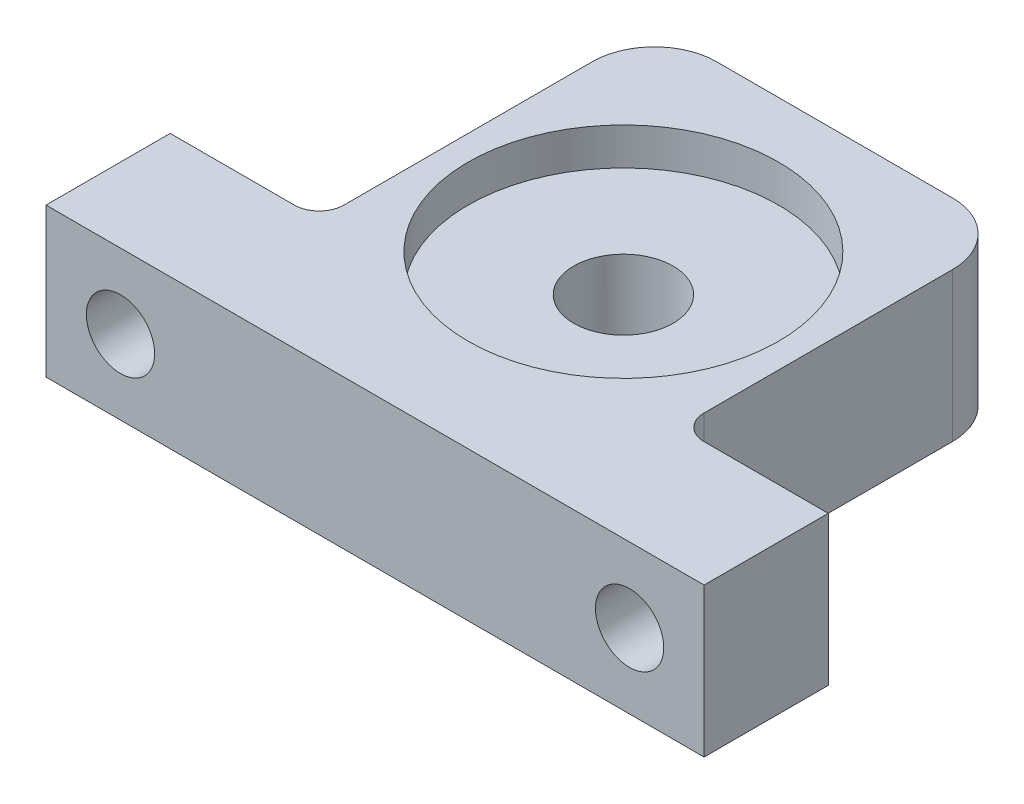
ISO-10303-21;
HEADER;
FILE_DESCRIPTION(('STEP AP214'),'2;1');
FILE_NAME('part.step','',(''),(''),'','','');
FILE_SCHEMA(('AUTOMOTIVE_DESIGN { 1 0 10303 214 1 1 1 1 }'));
ENDSEC;
DATA;
#1=APPLICATION_CONTEXT('core data for automotive mechanical design processes');
#2=APPLICATION_PROTOCOL_DEFINITION('international standard','automotive_design',2000,#1);
#3=PRODUCT_CONTEXT('',#1,'mechanical');
#4=PRODUCT('Part','Part','',(#3));
#5=PRODUCT_RELATED_PRODUCT_CATEGORY('part','',(#4));
#6=PRODUCT_DEFINITION_FORMATION('','',#4);
#7=PRODUCT_DEFINITION_CONTEXT('part definition',#1,'design');
#8=PRODUCT_DEFINITION('design','',#6,#7);
#9=PRODUCT_DEFINITION_SHAPE('','',#8);
#10=(LENGTH_UNIT() NAMED_UNIT(*) SI_UNIT(.MILLI.,.METRE.));
#11=(NAMED_UNIT(*) PLANE_ANGLE_UNIT() SI_UNIT($,.RADIAN.));
#12=(NAMED_UNIT(*) SI_UNIT($,.STERADIAN.) SOLID_ANGLE_UNIT());
#13=UNCERTAINTY_MEASURE_WITH_UNIT(LENGTH_MEASURE(1.E-05),#10,'distance_accuracy_value','');
#14=(GEOMETRIC_REPRESENTATION_CONTEXT(3) GLOBAL_UNCERTAINTY_ASSIGNED_CONTEXT((#13)) GLOBAL_UNIT_ASSIGNED_CONTEXT((#10,
#11,#12)) REPRESENTATION_CONTEXT('',''));
#15=CARTESIAN_POINT('',(0.,0.,0.));
#16=DIRECTION('',(0.,0.,1.));
#17=DIRECTION('',(1.,0.,0.));
#18=AXIS2_PLACEMENT_3D('',#15,#16,#17);
#19=CARTESIAN_POINT('',(26.5,6.,5.));
#20=DIRECTION('',(-1.,0.,0.));
#21=DIRECTION('',(0.,0.,1.));
#22=AXIS2_PLACEMENT_3D('',#19,#20,#21);
#23=PLANE('',#22);
#24=DIRECTION('',(0.,0.,-1.));
#25=VECTOR('',#24,1.);
#26=CARTESIAN_POINT('',(26.5,-6.,5.));
#27=LINE('',#26,#25);
#28=CARTESIAN_POINT('',(26.5,-6.,5.));
#29=VERTEX_POINT('',#28);
#30=CARTESIAN_POINT('',(26.5,-6.,-5.));
#31=VERTEX_POINT('',#30);
#32=EDGE_CURVE('E151',#29,#31,#27,.T.);
#33=ORIENTED_EDGE('',*,*,#32,.T.);
#34=DIRECTION('',(0.,-1.,0.));
#35=VECTOR('',#34,1.);
#36=CARTESIAN_POINT('',(26.5,6.,-5.));
#37=LINE('',#36,#35);
#38=CARTESIAN_POINT('',(26.5,6.,-5.));
#39=VERTEX_POINT('',#38);
#40=EDGE_CURVE('E132',#39,#31,#37,.T.);
#41=ORIENTED_EDGE('',*,*,#40,.F.);
#42=DIRECTION('',(0.,0.,-1.));
#43=VECTOR('',#42,1.);
#44=CARTESIAN_POINT('',(26.5,6.,5.));
#45=LINE('',#44,#43);
#46=CARTESIAN_POINT('',(26.5,6.,5.));
#47=VERTEX_POINT('',#46);
#48=EDGE_CURVE('E139',#47,#39,#45,.T.);
#49=ORIENTED_EDGE('',*,*,#48,.F.);
#50=DIRECTION('',(0.,-1.,0.));
#51=VECTOR('',#50,1.);
#52=CARTESIAN_POINT('',(26.5,6.,5.));
#53=LINE('',#52,#51);
#54=EDGE_CURVE('E205',#47,#29,#53,.T.);
#55=ORIENTED_EDGE('',*,*,#54,.T.);
#56=EDGE_LOOP('',(#33,#41,#49,#55));
#57=FACE_BOUND('',#56,.T.);
#58=ADVANCED_FACE('F36',(#57),#23,.F.);
#59=CARTESIAN_POINT('',(14.5,6.,-5.));
#60=DIRECTION('',(0.,0.,1.));
#61=DIRECTION('',(1.,0.,0.));
#62=AXIS2_PLACEMENT_3D('',#59,#60,#61);
#63=PLANE('',#62);
#64=CARTESIAN_POINT('',(20.5,0.,-5.));
#65=DIRECTION('',(0.,0.,1.));
#66=DIRECTION('',(1.,0.,0.));
#67=AXIS2_PLACEMENT_3D('',#64,#65,#66);
#68=CIRCLE('',#67,2.75);
#69=CARTESIAN_POINT('',(23.25,0.,-5.));
#70=VERTEX_POINT('',#69);
#71=EDGE_CURVE('E174',#70,#70,#68,.T.);
#72=ORIENTED_EDGE('',*,*,#71,.T.);
#73=EDGE_LOOP('',(#72));
#74=FACE_BOUND('',#73,.T.);
#75=DIRECTION('',(-1.,0.,0.));
#76=VECTOR('',#75,1.);
#77=CARTESIAN_POINT('',(14.5,-6.,-5.));
#78=LINE('',#77,#76);
#79=CARTESIAN_POINT('',(16.5,-6.,-5.));
#80=VERTEX_POINT('',#79);
#81=EDGE_CURVE('E207',#31,#80,#78,.T.);
#82=ORIENTED_EDGE('',*,*,#81,.T.);
#83=DIRECTION('',(0.,-1.,0.));
#84=VECTOR('',#83,1.);
#85=CARTESIAN_POINT('',(16.5,6.,-5.));
#86=LINE('',#85,#84);
#87=CARTESIAN_POINT('',(16.5,6.,-5.));
#88=VERTEX_POINT('',#87);
#89=EDGE_CURVE('E135',#80,#88,#86,.F.);
#90=ORIENTED_EDGE('',*,*,#89,.T.);
#91=DIRECTION('',(-1.,0.,0.));
#92=VECTOR('',#91,1.);
#93=CARTESIAN_POINT('',(14.5,6.,-5.));
#94=LINE('',#93,#92);
#95=EDGE_CURVE('E127',#39,#88,#94,.T.);
#96=ORIENTED_EDGE('',*,*,#95,.F.);
#97=ORIENTED_EDGE('',*,*,#40,.T.);
#98=EDGE_LOOP('',(#82,#90,#96,#97));
#99=FACE_BOUND('',#98,.T.);
#100=ADVANCED_FACE('F130',(#74,#99),#63,.F.);
#101=CARTESIAN_POINT('',(14.5,6.,-27.));
#102=DIRECTION('',(-1.,0.,0.));
#103=DIRECTION('',(0.,0.,1.));
#104=AXIS2_PLACEMENT_3D('',#101,#102,#103);
#105=PLANE('',#104);
#106=DIRECTION('',(0.,0.,-1.));
#107=VECTOR('',#106,1.);
#108=CARTESIAN_POINT('',(14.5,6.,-27.));
#109=LINE('',#108,#107);
#110=CARTESIAN_POINT('',(14.5,6.,-7.));
#111=VERTEX_POINT('',#110);
#112=CARTESIAN_POINT('',(14.5,6.,-27.));
#113=VERTEX_POINT('',#112);
#114=EDGE_CURVE('E138',#111,#113,#109,.T.);
#115=ORIENTED_EDGE('',*,*,#114,.F.);
#116=DIRECTION('',(0.,-1.,0.));
#117=VECTOR('',#116,1.);
#118=CARTESIAN_POINT('',(14.5,-6.,-7.));
#119=LINE('',#118,#117);
#120=CARTESIAN_POINT('',(14.5,-6.,-7.));
#121=VERTEX_POINT('',#120);
#122=EDGE_CURVE('E152',#111,#121,#119,.T.);
#123=ORIENTED_EDGE('',*,*,#122,.T.);
#124=DIRECTION('',(0.,0.,-1.));
#125=VECTOR('',#124,1.);
#126=CARTESIAN_POINT('',(14.5,-6.,-27.));
#127=LINE('',#126,#125);
#128=CARTESIAN_POINT('',(14.5,-6.,-27.));
#129=VERTEX_POINT('',#128);
#130=EDGE_CURVE('E209',#121,#129,#127,.T.);
#131=ORIENTED_EDGE('',*,*,#130,.T.);
#132=DIRECTION('',(0.,-1.,0.));
#133=VECTOR('',#132,1.);
#134=CARTESIAN_POINT('',(14.5,6.,-27.));
#135=LINE('',#134,#133);
#136=EDGE_CURVE('E153',#113,#129,#135,.T.);
#137=ORIENTED_EDGE('',*,*,#136,.F.);
#138=EDGE_LOOP('',(#115,#123,#131,#137));
#139=FACE_BOUND('',#138,.T.);
#140=ADVANCED_FACE('F275',(#139),#105,.F.);
#141=CARTESIAN_POINT('',(9.50000000000001,6.,-27.));
#142=DIRECTION('',(0.,-1.,0.));
#143=DIRECTION('',(0.,0.,-1.));
#144=AXIS2_PLACEMENT_3D('',#141,#142,#143);
#145=CYLINDRICAL_SURFACE('',#144,5.);
#146=CARTESIAN_POINT('',(9.50000000000001,-6.,-27.));
#147=DIRECTION('',(0.,1.,0.));
#148=DIRECTION('',(0.,0.,1.));
#149=AXIS2_PLACEMENT_3D('',#146,#147,#148);
#150=CIRCLE('',#149,5.);
#151=CARTESIAN_POINT('',(9.50000000000001,-6.,-32.));
#152=VERTEX_POINT('',#151);
#153=EDGE_CURVE('E211',#129,#152,#150,.T.);
#154=ORIENTED_EDGE('',*,*,#153,.T.);
#155=DIRECTION('',(0.,-1.,0.));
#156=VECTOR('',#155,1.);
#157=CARTESIAN_POINT('',(9.50000000000001,6.,-32.));
#158=LINE('',#157,#156);
#159=CARTESIAN_POINT('',(9.50000000000001,6.,-32.));
#160=VERTEX_POINT('',#159);
#161=EDGE_CURVE('E158',#160,#152,#158,.T.);
#162=ORIENTED_EDGE('',*,*,#161,.F.);
#163=CARTESIAN_POINT('',(9.50000000000001,6.,-27.));
#164=DIRECTION('',(0.,1.,0.));
#165=DIRECTION('',(0.,0.,1.));
#166=AXIS2_PLACEMENT_3D('',#163,#164,#165);
#167=CIRCLE('',#166,5.);
#168=EDGE_CURVE('E192',#113,#160,#167,.T.);
#169=ORIENTED_EDGE('',*,*,#168,.F.);
#170=ORIENTED_EDGE('',*,*,#136,.T.);
#171=EDGE_LOOP('',(#154,#162,#169,#170));
#172=FACE_BOUND('',#171,.T.);
#173=ADVANCED_FACE('F276',(#172),#145,.T.);
#174=CARTESIAN_POINT('',(-9.5,6.,-32.));
#175=DIRECTION('',(0.,0.,1.));
#176=DIRECTION('',(1.,0.,0.));
#177=AXIS2_PLACEMENT_3D('',#174,#175,#176);
#178=PLANE('',#177);
#179=DIRECTION('',(-1.,0.,0.));
#180=VECTOR('',#179,1.);
#181=CARTESIAN_POINT('',(-9.5,-6.,-32.));
#182=LINE('',#181,#180);
#183=CARTESIAN_POINT('',(-9.5,-6.,-32.));
#184=VERTEX_POINT('',#183);
#185=EDGE_CURVE('E213',#152,#184,#182,.T.);
#186=ORIENTED_EDGE('',*,*,#185,.T.);
#187=DIRECTION('',(0.,-1.,0.));
#188=VECTOR('',#187,1.);
#189=CARTESIAN_POINT('',(-9.5,6.,-32.));
#190=LINE('',#189,#188);
#191=CARTESIAN_POINT('',(-9.5,6.,-32.));
#192=VERTEX_POINT('',#191);
#193=EDGE_CURVE('E234',#192,#184,#190,.T.);
#194=ORIENTED_EDGE('',*,*,#193,.F.);
#195=DIRECTION('',(-1.,0.,0.));
#196=VECTOR('',#195,1.);
#197=CARTESIAN_POINT('',(-9.5,6.,-32.));
#198=LINE('',#197,#196);
#199=EDGE_CURVE('E194',#160,#192,#198,.T.);
#200=ORIENTED_EDGE('',*,*,#199,.F.);
#201=ORIENTED_EDGE('',*,*,#161,.T.);
#202=EDGE_LOOP('',(#186,#194,#200,#201));
#203=FACE_BOUND('',#202,.T.);
#204=ADVANCED_FACE('F241',(#203),#178,.F.);
#205=CARTESIAN_POINT('',(-9.5,6.,-27.));
#206=DIRECTION('',(0.,-1.,0.));
#207=DIRECTION('',(0.,0.,-1.));
#208=AXIS2_PLACEMENT_3D('',#205,#206,#207);
#209=CYLINDRICAL_SURFACE('',#208,5.00000000000001);
#210=CARTESIAN_POINT('',(-9.5,-6.,-27.));
#211=DIRECTION('',(0.,1.,0.));
#212=DIRECTION('',(0.,0.,1.));
#213=AXIS2_PLACEMENT_3D('',#210,#211,#212);
#214=CIRCLE('',#213,5.00000000000001);
#215=CARTESIAN_POINT('',(-14.5,-6.,-27.));
#216=VERTEX_POINT('',#215);
#217=EDGE_CURVE('E215',#184,#216,#214,.T.);
#218=ORIENTED_EDGE('',*,*,#217,.T.);
#219=DIRECTION('',(0.,-1.,0.));
#220=VECTOR('',#219,1.);
#221=CARTESIAN_POINT('',(-14.5,6.,-27.));
#222=LINE('',#221,#220);
#223=CARTESIAN_POINT('',(-14.5,6.,-27.));
#224=VERTEX_POINT('',#223);
#225=EDGE_CURVE('E231',#224,#216,#222,.T.);
#226=ORIENTED_EDGE('',*,*,#225,.F.);
#227=CARTESIAN_POINT('',(-9.5,6.,-27.));
#228=DIRECTION('',(0.,1.,0.));
#229=DIRECTION('',(0.,0.,1.));
#230=AXIS2_PLACEMENT_3D('',#227,#228,#229);
#231=CIRCLE('',#230,5.00000000000001);
#232=EDGE_CURVE('E196',#192,#224,#231,.T.);
#233=ORIENTED_EDGE('',*,*,#232,.F.);
#234=ORIENTED_EDGE('',*,*,#193,.T.);
#235=EDGE_LOOP('',(#218,#226,#233,#234));
#236=FACE_BOUND('',#235,.T.);
#237=ADVANCED_FACE('F251',(#236),#209,.T.);
#238=CARTESIAN_POINT('',(-14.5,6.,-27.));
#239=DIRECTION('',(1.,0.,0.));
#240=DIRECTION('',(0.,0.,-1.));
#241=AXIS2_PLACEMENT_3D('',#238,#239,#240);
#242=PLANE('',#241);
#243=DIRECTION('',(0.,0.,1.));
#244=VECTOR('',#243,1.);
#245=CARTESIAN_POINT('',(-14.5,-6.,-27.));
#246=LINE('',#245,#244);
#247=CARTESIAN_POINT('',(-14.5,-6.,-7.));
#248=VERTEX_POINT('',#247);
#249=EDGE_CURVE('E217',#216,#248,#246,.T.);
#250=ORIENTED_EDGE('',*,*,#249,.T.);
#251=DIRECTION('',(0.,-1.,0.));
#252=VECTOR('',#251,1.);
#253=CARTESIAN_POINT('',(-14.5,6.,-7.));
#254=LINE('',#253,#252);
#255=CARTESIAN_POINT('',(-14.5,6.,-7.));
#256=VERTEX_POINT('',#255);
#257=EDGE_CURVE('E53',#248,#256,#254,.F.);
#258=ORIENTED_EDGE('',*,*,#257,.T.);
#259=DIRECTION('',(0.,0.,1.));
#260=VECTOR('',#259,1.);
#261=CARTESIAN_POINT('',(-14.5,6.,-27.));
#262=LINE('',#261,#260);
#263=EDGE_CURVE('E198',#224,#256,#262,.T.);
#264=ORIENTED_EDGE('',*,*,#263,.F.);
#265=ORIENTED_EDGE('',*,*,#225,.T.);
#266=EDGE_LOOP('',(#250,#258,#264,#265));
#267=FACE_BOUND('',#266,.T.);
#268=ADVANCED_FACE('F253',(#267),#242,.F.);
#269=CARTESIAN_POINT('',(-26.5,6.,-5.));
#270=DIRECTION('',(0.,0.,1.));
#271=DIRECTION('',(1.,0.,0.));
#272=AXIS2_PLACEMENT_3D('',#269,#270,#271);
#273=PLANE('',#272);
#274=CARTESIAN_POINT('',(-20.5,0.,-5.));
#275=DIRECTION('',(0.,0.,1.));
#276=DIRECTION('',(1.,0.,0.));
#277=AXIS2_PLACEMENT_3D('',#274,#275,#276);
#278=CIRCLE('',#277,2.75);
#279=CARTESIAN_POINT('',(-17.75,0.,-5.));
#280=VERTEX_POINT('',#279);
#281=EDGE_CURVE('E178',#280,#280,#278,.T.);
#282=ORIENTED_EDGE('',*,*,#281,.T.);
#283=EDGE_LOOP('',(#282));
#284=FACE_BOUND('',#283,.T.);
#285=DIRECTION('',(-1.,0.,0.));
#286=VECTOR('',#285,1.);
#287=CARTESIAN_POINT('',(-26.5,6.,-5.));
#288=LINE('',#287,#286);
#289=CARTESIAN_POINT('',(-16.5,6.,-5.));
#290=VERTEX_POINT('',#289);
#291=CARTESIAN_POINT('',(-26.5,6.,-5.));
#292=VERTEX_POINT('',#291);
#293=EDGE_CURVE('E200',#290,#292,#288,.T.);
#294=ORIENTED_EDGE('',*,*,#293,.F.);
#295=DIRECTION('',(0.,-1.,0.));
#296=VECTOR('',#295,1.);
#297=CARTESIAN_POINT('',(-16.5,-6.,-5.));
#298=LINE('',#297,#296);
#299=CARTESIAN_POINT('',(-16.5,-6.,-5.));
#300=VERTEX_POINT('',#299);
#301=EDGE_CURVE('E163',#290,#300,#298,.T.);
#302=ORIENTED_EDGE('',*,*,#301,.T.);
#303=DIRECTION('',(-1.,0.,0.));
#304=VECTOR('',#303,1.);
#305=CARTESIAN_POINT('',(-26.5,-6.,-5.));
#306=LINE('',#305,#304);
#307=CARTESIAN_POINT('',(-26.5,-6.,-5.));
#308=VERTEX_POINT('',#307);
#309=EDGE_CURVE('E219',#300,#308,#306,.T.);
#310=ORIENTED_EDGE('',*,*,#309,.T.);
#311=DIRECTION('',(0.,-1.,0.));
#312=VECTOR('',#311,1.);
#313=CARTESIAN_POINT('',(-26.5,6.,-5.));
#314=LINE('',#313,#312);
#315=EDGE_CURVE('E228',#292,#308,#314,.T.);
#316=ORIENTED_EDGE('',*,*,#315,.F.);
#317=EDGE_LOOP('',(#294,#302,#310,#316));
#318=FACE_BOUND('',#317,.T.);
#319=ADVANCED_FACE('F259',(#284,#318),#273,.F.);
#320=CARTESIAN_POINT('',(-26.5,6.,5.));
#321=DIRECTION('',(1.,0.,0.));
#322=DIRECTION('',(0.,0.,-1.));
#323=AXIS2_PLACEMENT_3D('',#320,#321,#322);
#324=PLANE('',#323);
#325=DIRECTION('',(0.,0.,1.));
#326=VECTOR('',#325,1.);
#327=CARTESIAN_POINT('',(-26.5,-6.,5.));
#328=LINE('',#327,#326);
#329=CARTESIAN_POINT('',(-26.5,-6.,5.));
#330=VERTEX_POINT('',#329);
#331=EDGE_CURVE('E221',#308,#330,#328,.T.);
#332=ORIENTED_EDGE('',*,*,#331,.T.);
#333=DIRECTION('',(0.,-1.,0.));
#334=VECTOR('',#333,1.);
#335=CARTESIAN_POINT('',(-26.5,6.,5.));
#336=LINE('',#335,#334);
#337=CARTESIAN_POINT('',(-26.5,6.,5.));
#338=VERTEX_POINT('',#337);
#339=EDGE_CURVE('E225',#338,#330,#336,.T.);
#340=ORIENTED_EDGE('',*,*,#339,.F.);
#341=DIRECTION('',(0.,0.,1.));
#342=VECTOR('',#341,1.);
#343=CARTESIAN_POINT('',(-26.5,6.,5.));
#344=LINE('',#343,#342);
#345=EDGE_CURVE('E202',#292,#338,#344,.T.);
#346=ORIENTED_EDGE('',*,*,#345,.F.);
#347=ORIENTED_EDGE('',*,*,#315,.T.);
#348=EDGE_LOOP('',(#332,#340,#346,#347));
#349=FACE_BOUND('',#348,.T.);
#350=ADVANCED_FACE('F265',(#349),#324,.F.);
#351=CARTESIAN_POINT('',(-26.5,6.,5.));
#352=DIRECTION('',(0.,0.,-1.));
#353=DIRECTION('',(-1.,0.,0.));
#354=AXIS2_PLACEMENT_3D('',#351,#352,#353);
#355=PLANE('',#354);
#356=CARTESIAN_POINT('',(-20.5,0.,5.));
#357=DIRECTION('',(0.,0.,-1.));
#358=DIRECTION('',(-1.,0.,0.));
#359=AXIS2_PLACEMENT_3D('',#356,#357,#358);
#360=CIRCLE('',#359,2.75);
#361=CARTESIAN_POINT('',(-23.25,0.,5.));
#362=VERTEX_POINT('',#361);
#363=EDGE_CURVE('E176',#362,#362,#360,.T.);
#364=ORIENTED_EDGE('',*,*,#363,.T.);
#365=EDGE_LOOP('',(#364));
#366=FACE_BOUND('',#365,.T.);
#367=CARTESIAN_POINT('',(20.5,0.,5.));
#368=DIRECTION('',(0.,0.,-1.));
#369=DIRECTION('',(-1.,0.,0.));
#370=AXIS2_PLACEMENT_3D('',#367,#368,#369);
#371=CIRCLE('',#370,2.75);
#372=CARTESIAN_POINT('',(17.75,0.,5.));
#373=VERTEX_POINT('',#372);
#374=EDGE_CURVE('E172',#373,#373,#371,.T.);
#375=ORIENTED_EDGE('',*,*,#374,.T.);
#376=EDGE_LOOP('',(#375));
#377=FACE_BOUND('',#376,.T.);
#378=DIRECTION('',(1.,0.,0.));
#379=VECTOR('',#378,1.);
#380=CARTESIAN_POINT('',(-26.5,-6.,5.));
#381=LINE('',#380,#379);
#382=EDGE_CURVE('E148',#330,#29,#381,.T.);
#383=ORIENTED_EDGE('',*,*,#382,.T.);
#384=ORIENTED_EDGE('',*,*,#54,.F.);
#385=DIRECTION('',(1.,0.,0.));
#386=VECTOR('',#385,1.);
#387=CARTESIAN_POINT('',(-26.5,6.,5.));
#388=LINE('',#387,#386);
#389=EDGE_CURVE('E144',#338,#47,#388,.T.);
#390=ORIENTED_EDGE('',*,*,#389,.F.);
#391=ORIENTED_EDGE('',*,*,#339,.T.);
#392=EDGE_LOOP('',(#383,#384,#390,#391));
#393=FACE_BOUND('',#392,.T.);
#394=ADVANCED_FACE('F268',(#366,#377,#393),#355,.F.);
#395=CARTESIAN_POINT('',(9.50000000000001,6.,-27.));
#396=DIRECTION('',(0.,1.,0.));
#397=DIRECTION('',(0.,0.,1.));
#398=AXIS2_PLACEMENT_3D('',#395,#396,#397);
#399=PLANE('',#398);
#400=CARTESIAN_POINT('',(0.,6.,-15.));
#401=DIRECTION('',(0.,1.,0.));
#402=DIRECTION('',(0.,0.,1.));
#403=AXIS2_PLACEMENT_3D('',#400,#401,#402);
#404=CIRCLE('',#403,12.5);
#405=CARTESIAN_POINT('',(0.,6.,-2.5));
#406=VERTEX_POINT('',#405);
#407=EDGE_CURVE('E474',#406,#406,#404,.T.);
#408=ORIENTED_EDGE('',*,*,#407,.F.);
#409=EDGE_LOOP('',(#408));
#410=FACE_BOUND('',#409,.T.);
#411=ORIENTED_EDGE('',*,*,#48,.T.);
#412=ORIENTED_EDGE('',*,*,#95,.T.);
#413=CARTESIAN_POINT('',(16.5,6.,-7.));
#414=DIRECTION('',(0.,1.,0.));
#415=DIRECTION('',(0.,0.,1.));
#416=AXIS2_PLACEMENT_3D('',#413,#414,#415);
#417=CIRCLE('',#416,2.);
#418=EDGE_CURVE('E169',#88,#111,#417,.F.);
#419=ORIENTED_EDGE('',*,*,#418,.T.);
#420=ORIENTED_EDGE('',*,*,#114,.T.);
#421=ORIENTED_EDGE('',*,*,#168,.T.);
#422=ORIENTED_EDGE('',*,*,#199,.T.);
#423=ORIENTED_EDGE('',*,*,#232,.T.);
#424=ORIENTED_EDGE('',*,*,#263,.T.);
#425=CARTESIAN_POINT('',(-16.5,6.,-7.));
#426=DIRECTION('',(0.,1.,0.));
#427=DIRECTION('',(0.,0.,1.));
#428=AXIS2_PLACEMENT_3D('',#425,#426,#427);
#429=CIRCLE('',#428,2.);
#430=EDGE_CURVE('E11',#256,#290,#429,.F.);
#431=ORIENTED_EDGE('',*,*,#430,.T.);
#432=ORIENTED_EDGE('',*,*,#293,.T.);
#433=ORIENTED_EDGE('',*,*,#345,.T.);
#434=ORIENTED_EDGE('',*,*,#389,.T.);
#435=EDGE_LOOP('',(#411,#412,#419,#420,#421,#422,#423,#424,#431,#432,#433,#434));
#436=FACE_BOUND('',#435,.T.);
#437=ADVANCED_FACE('F142',(#410,#436),#399,.T.);
#438=CARTESIAN_POINT('',(9.50000000000001,-6.,-27.));
#439=DIRECTION('',(0.,1.,0.));
#440=DIRECTION('',(0.,0.,1.));
#441=AXIS2_PLACEMENT_3D('',#438,#439,#440);
#442=PLANE('',#441);
#443=CARTESIAN_POINT('',(0.,-6.,-15.));
#444=DIRECTION('',(0.,-1.,0.));
#445=DIRECTION('',(0.,0.,-1.));
#446=AXIS2_PLACEMENT_3D('',#443,#444,#445);
#447=CIRCLE('',#446,9.);
#448=CARTESIAN_POINT('',(0.,-6.,-24.));
#449=VERTEX_POINT('',#448);
#450=EDGE_CURVE('E188',#449,#449,#447,.T.);
#451=ORIENTED_EDGE('',*,*,#450,.F.);
#452=EDGE_LOOP('',(#451));
#453=FACE_BOUND('',#452,.T.);
#454=ORIENTED_EDGE('',*,*,#32,.F.);
#455=ORIENTED_EDGE('',*,*,#382,.F.);
#456=ORIENTED_EDGE('',*,*,#331,.F.);
#457=ORIENTED_EDGE('',*,*,#309,.F.);
#458=CARTESIAN_POINT('',(-16.5,-6.,-7.));
#459=DIRECTION('',(0.,1.,0.));
#460=DIRECTION('',(0.,0.,1.));
#461=AXIS2_PLACEMENT_3D('',#458,#459,#460);
#462=CIRCLE('',#461,2.);
#463=EDGE_CURVE('E45',#300,#248,#462,.T.);
#464=ORIENTED_EDGE('',*,*,#463,.T.);
#465=ORIENTED_EDGE('',*,*,#249,.F.);
#466=ORIENTED_EDGE('',*,*,#217,.F.);
#467=ORIENTED_EDGE('',*,*,#185,.F.);
#468=ORIENTED_EDGE('',*,*,#153,.F.);
#469=ORIENTED_EDGE('',*,*,#130,.F.);
#470=CARTESIAN_POINT('',(16.5,-6.,-7.));
#471=DIRECTION('',(0.,1.,0.));
#472=DIRECTION('',(0.,0.,1.));
#473=AXIS2_PLACEMENT_3D('',#470,#471,#472);
#474=CIRCLE('',#473,2.);
#475=EDGE_CURVE('E167',#121,#80,#474,.T.);
#476=ORIENTED_EDGE('',*,*,#475,.T.);
#477=ORIENTED_EDGE('',*,*,#81,.F.);
#478=EDGE_LOOP('',(#454,#455,#456,#457,#464,#465,#466,#467,#468,#469,#476,#477));
#479=FACE_BOUND('',#478,.T.);
#480=ADVANCED_FACE('F247',(#453,#479),#442,.F.);
#481=CARTESIAN_POINT('',(16.5,6.,-7.));
#482=DIRECTION('',(0.,1.,0.));
#483=DIRECTION('',(0.,0.,1.));
#484=AXIS2_PLACEMENT_3D('',#481,#482,#483);
#485=CYLINDRICAL_SURFACE('',#484,2.);
#486=ORIENTED_EDGE('',*,*,#418,.F.);
#487=ORIENTED_EDGE('',*,*,#89,.F.);
#488=ORIENTED_EDGE('',*,*,#475,.F.);
#489=ORIENTED_EDGE('',*,*,#122,.F.);
#490=EDGE_LOOP('',(#486,#487,#488,#489));
#491=FACE_BOUND('',#490,.T.);
#492=ADVANCED_FACE('F270',(#491),#485,.F.);
#493=CARTESIAN_POINT('',(-16.5,6.,-7.));
#494=DIRECTION('',(0.,1.,0.));
#495=DIRECTION('',(0.,0.,1.));
#496=AXIS2_PLACEMENT_3D('',#493,#494,#495);
#497=CYLINDRICAL_SURFACE('',#496,2.);
#498=ORIENTED_EDGE('',*,*,#430,.F.);
#499=ORIENTED_EDGE('',*,*,#257,.F.);
#500=ORIENTED_EDGE('',*,*,#463,.F.);
#501=ORIENTED_EDGE('',*,*,#301,.F.);
#502=EDGE_LOOP('',(#498,#499,#500,#501));
#503=FACE_BOUND('',#502,.T.);
#504=ADVANCED_FACE('F38',(#503),#497,.F.);
#505=CARTESIAN_POINT('',(20.5,0.,135.));
#506=DIRECTION('',(0.,0.,-1.));
#507=DIRECTION('',(-1.,0.,0.));
#508=AXIS2_PLACEMENT_3D('',#505,#506,#507);
#509=CYLINDRICAL_SURFACE('',#508,2.75);
#510=ORIENTED_EDGE('',*,*,#374,.F.);
#511=EDGE_LOOP('',(#510));
#512=FACE_BOUND('',#511,.T.);
#513=ORIENTED_EDGE('',*,*,#71,.F.);
#514=EDGE_LOOP('',(#513));
#515=FACE_BOUND('',#514,.T.);
#516=ADVANCED_FACE('F296',(#512,#515),#509,.F.);
#517=CARTESIAN_POINT('',(-20.5,0.,135.));
#518=DIRECTION('',(0.,0.,-1.));
#519=DIRECTION('',(-1.,0.,0.));
#520=AXIS2_PLACEMENT_3D('',#517,#518,#519);
#521=CYLINDRICAL_SURFACE('',#520,2.75);
#522=ORIENTED_EDGE('',*,*,#363,.F.);
#523=EDGE_LOOP('',(#522));
#524=FACE_BOUND('',#523,.T.);
#525=ORIENTED_EDGE('',*,*,#281,.F.);
#526=EDGE_LOOP('',(#525));
#527=FACE_BOUND('',#526,.T.);
#528=ADVANCED_FACE('F398',(#524,#527),#521,.F.);
#529=CARTESIAN_POINT('',(0.,-4.,-15.));
#530=DIRECTION('',(0.,-1.,0.));
#531=DIRECTION('',(0.,0.,-1.));
#532=AXIS2_PLACEMENT_3D('',#529,#530,#531);
#533=CYLINDRICAL_SURFACE('',#532,9.);
#534=CARTESIAN_POINT('',(0.,-4.,-15.));
#535=DIRECTION('',(0.,-1.,0.));
#536=DIRECTION('',(0.,0.,-1.));
#537=AXIS2_PLACEMENT_3D('',#534,#535,#536);
#538=CIRCLE('',#537,9.);
#539=CARTESIAN_POINT('',(0.,-4.,-24.));
#540=VERTEX_POINT('',#539);
#541=EDGE_CURVE('E175',#540,#540,#538,.T.);
#542=ORIENTED_EDGE('',*,*,#541,.F.);
#543=EDGE_LOOP('',(#542));
#544=FACE_BOUND('',#543,.T.);
#545=ORIENTED_EDGE('',*,*,#450,.T.);
#546=EDGE_LOOP('',(#545));
#547=FACE_BOUND('',#546,.T.);
#548=ADVANCED_FACE('F351',(#544,#547),#533,.F.);
#549=CARTESIAN_POINT('',(0.,-4.,-15.));
#550=DIRECTION('',(0.,-1.,0.));
#551=DIRECTION('',(0.,0.,-1.));
#552=AXIS2_PLACEMENT_3D('',#549,#550,#551);
#553=PLANE('',#552);
#554=CARTESIAN_POINT('',(0.,-4.,-15.));
#555=DIRECTION('',(0.,-1.,0.));
#556=DIRECTION('',(0.,0.,-1.));
#557=AXIS2_PLACEMENT_3D('',#554,#555,#556);
#558=CIRCLE('',#557,4.);
#559=CARTESIAN_POINT('',(0.,-4.,-19.));
#560=VERTEX_POINT('',#559);
#561=EDGE_CURVE('E40',#560,#560,#558,.T.);
#562=ORIENTED_EDGE('',*,*,#561,.F.);
#563=EDGE_LOOP('',(#562));
#564=FACE_BOUND('',#563,.T.);
#565=ORIENTED_EDGE('',*,*,#541,.T.);
#566=EDGE_LOOP('',(#565));
#567=FACE_BOUND('',#566,.T.);
#568=ADVANCED_FACE('F361',(#564,#567),#553,.T.);
#569=CARTESIAN_POINT('',(0.,3.,-15.));
#570=DIRECTION('',(0.,1.,0.));
#571=DIRECTION('',(0.,0.,1.));
#572=AXIS2_PLACEMENT_3D('',#569,#570,#571);
#573=CYLINDRICAL_SURFACE('',#572,12.5);
#574=CARTESIAN_POINT('',(0.,3.,-15.));
#575=DIRECTION('',(0.,1.,0.));
#576=DIRECTION('',(0.,0.,1.));
#577=AXIS2_PLACEMENT_3D('',#574,#575,#576);
#578=CIRCLE('',#577,12.5);
#579=CARTESIAN_POINT('',(0.,3.,-2.5));
#580=VERTEX_POINT('',#579);
#581=EDGE_CURVE('E472',#580,#580,#578,.T.);
#582=ORIENTED_EDGE('',*,*,#581,.F.);
#583=EDGE_LOOP('',(#582));
#584=FACE_BOUND('',#583,.T.);
#585=ORIENTED_EDGE('',*,*,#407,.T.);
#586=EDGE_LOOP('',(#585));
#587=FACE_BOUND('',#586,.T.);
#588=ADVANCED_FACE('F355',(#584,#587),#573,.F.);
#589=CARTESIAN_POINT('',(0.,3.,-15.));
#590=DIRECTION('',(0.,1.,0.));
#591=DIRECTION('',(0.,0.,1.));
#592=AXIS2_PLACEMENT_3D('',#589,#590,#591);
#593=PLANE('',#592);
#594=CARTESIAN_POINT('',(0.,3.,-15.));
#595=DIRECTION('',(0.,1.,0.));
#596=DIRECTION('',(0.,0.,1.));
#597=AXIS2_PLACEMENT_3D('',#594,#595,#596);
#598=CIRCLE('',#597,4.);
#599=CARTESIAN_POINT('',(0.,3.,-11.));
#600=VERTEX_POINT('',#599);
#601=EDGE_CURVE('E481',#600,#600,#598,.T.);
#602=ORIENTED_EDGE('',*,*,#601,.F.);
#603=EDGE_LOOP('',(#602));
#604=FACE_BOUND('',#603,.T.);
#605=ORIENTED_EDGE('',*,*,#581,.T.);
#606=EDGE_LOOP('',(#605));
#607=FACE_BOUND('',#606,.T.);
#608=ADVANCED_FACE('F360',(#604,#607),#593,.T.);
#609=CARTESIAN_POINT('',(0.,-73.,-15.));
#610=DIRECTION('',(0.,1.,0.));
#611=DIRECTION('',(0.,0.,1.));
#612=AXIS2_PLACEMENT_3D('',#609,#610,#611);
#613=CYLINDRICAL_SURFACE('',#612,4.);
#614=ORIENTED_EDGE('',*,*,#561,.T.);
#615=EDGE_LOOP('',(#614));
#616=FACE_BOUND('',#615,.T.);
#617=ORIENTED_EDGE('',*,*,#601,.T.);
#618=EDGE_LOOP('',(#617));
#619=FACE_BOUND('',#618,.T.);
#620=ADVANCED_FACE('F380',(#616,#619),#613,.F.);
#621=CLOSED_SHELL('',(#58,#100,#140,#173,#204,#237,#268,#319,#350,#394,#437,#480,#492,#504,#516,
#528,#548,#568,#588,#608,#620));
#622=MANIFOLD_SOLID_BREP('B2',#621);
#623=ADVANCED_BREP_SHAPE_REPRESENTATION('',(#18,#622),#14);
#624=SHAPE_DEFINITION_REPRESENTATION(#9,#623);
ENDSEC;
END-ISO-10303-21;
